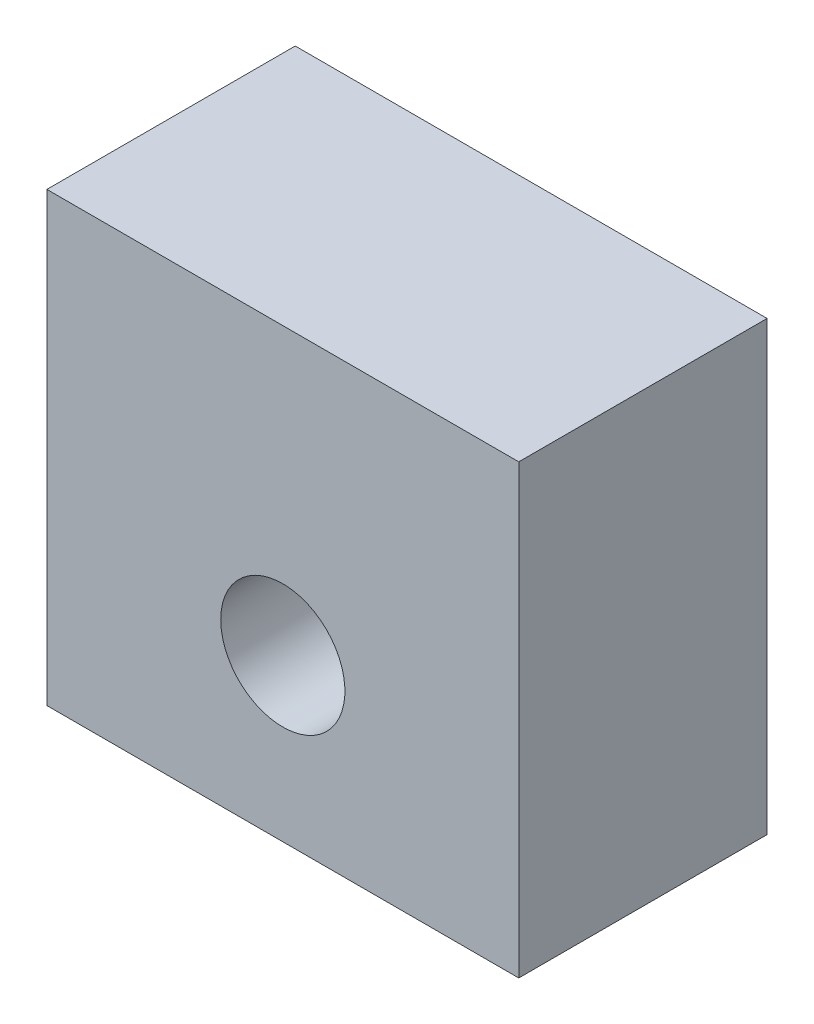
ISO-10303-21;
HEADER;
FILE_DESCRIPTION(('STEP AP214'),'2;1');
FILE_NAME('part.step','',(''),(''),'','','');
FILE_SCHEMA(('AUTOMOTIVE_DESIGN { 1 0 10303 214 1 1 1 1 }'));
ENDSEC;
DATA;
#1=APPLICATION_CONTEXT('core data for automotive mechanical design processes');
#2=APPLICATION_PROTOCOL_DEFINITION('international standard','automotive_design',2000,#1);
#3=PRODUCT_CONTEXT('',#1,'mechanical');
#4=PRODUCT('Part','Part','',(#3));
#5=PRODUCT_RELATED_PRODUCT_CATEGORY('part','',(#4));
#6=PRODUCT_DEFINITION_FORMATION('','',#4);
#7=PRODUCT_DEFINITION_CONTEXT('part definition',#1,'design');
#8=PRODUCT_DEFINITION('design','',#6,#7);
#9=PRODUCT_DEFINITION_SHAPE('','',#8);
#10=(LENGTH_UNIT() NAMED_UNIT(*) SI_UNIT(.MILLI.,.METRE.));
#11=(NAMED_UNIT(*) PLANE_ANGLE_UNIT() SI_UNIT($,.RADIAN.));
#12=(NAMED_UNIT(*) SI_UNIT($,.STERADIAN.) SOLID_ANGLE_UNIT());
#13=UNCERTAINTY_MEASURE_WITH_UNIT(LENGTH_MEASURE(1.E-05),#10,'distance_accuracy_value','');
#14=(GEOMETRIC_REPRESENTATION_CONTEXT(3) GLOBAL_UNCERTAINTY_ASSIGNED_CONTEXT((#13)) GLOBAL_UNIT_ASSIGNED_CONTEXT((#10,
#11,#12)) REPRESENTATION_CONTEXT('',''));
#15=CARTESIAN_POINT('',(0.,0.,0.));
#16=DIRECTION('',(0.,0.,1.));
#17=DIRECTION('',(1.,0.,0.));
#18=AXIS2_PLACEMENT_3D('',#15,#16,#17);
#19=CARTESIAN_POINT('',(0.,0.,10.));
#20=DIRECTION('',(1.,0.,0.));
#21=DIRECTION('',(0.,0.,-1.));
#22=AXIS2_PLACEMENT_3D('',#19,#20,#21);
#23=PLANE('',#22);
#24=DIRECTION('',(0.,-1.,0.));
#25=VECTOR('',#24,1.);
#26=CARTESIAN_POINT('',(0.,0.,0.));
#27=LINE('',#26,#25);
#28=CARTESIAN_POINT('',(0.,18.,0.));
#29=VERTEX_POINT('',#28);
#30=CARTESIAN_POINT('',(0.,0.,0.));
#31=VERTEX_POINT('',#30);
#32=EDGE_CURVE('E97',#29,#31,#27,.T.);
#33=ORIENTED_EDGE('',*,*,#32,.T.);
#34=DIRECTION('',(0.,0.,-1.));
#35=VECTOR('',#34,1.);
#36=CARTESIAN_POINT('',(0.,0.,10.));
#37=LINE('',#36,#35);
#38=CARTESIAN_POINT('',(0.,0.,10.));
#39=VERTEX_POINT('',#38);
#40=EDGE_CURVE('E11',#39,#31,#37,.T.);
#41=ORIENTED_EDGE('',*,*,#40,.F.);
#42=DIRECTION('',(0.,-1.,0.));
#43=VECTOR('',#42,1.);
#44=CARTESIAN_POINT('',(0.,0.,10.));
#45=LINE('',#44,#43);
#46=CARTESIAN_POINT('',(0.,18.,10.));
#47=VERTEX_POINT('',#46);
#48=EDGE_CURVE('E85',#47,#39,#45,.T.);
#49=ORIENTED_EDGE('',*,*,#48,.F.);
#50=DIRECTION('',(0.,0.,-1.));
#51=VECTOR('',#50,1.);
#52=CARTESIAN_POINT('',(0.,18.,10.));
#53=LINE('',#52,#51);
#54=EDGE_CURVE('E93',#47,#29,#53,.T.);
#55=ORIENTED_EDGE('',*,*,#54,.T.);
#56=EDGE_LOOP('',(#33,#41,#49,#55));
#57=FACE_BOUND('',#56,.T.);
#58=ADVANCED_FACE('F34',(#57),#23,.F.);
#59=CARTESIAN_POINT('',(0.,0.,10.));
#60=DIRECTION('',(0.,1.,0.));
#61=DIRECTION('',(0.,0.,1.));
#62=AXIS2_PLACEMENT_3D('',#59,#60,#61);
#63=PLANE('',#62);
#64=DIRECTION('',(1.,0.,0.));
#65=VECTOR('',#64,1.);
#66=CARTESIAN_POINT('',(0.,0.,0.));
#67=LINE('',#66,#65);
#68=CARTESIAN_POINT('',(19.,0.,0.));
#69=VERTEX_POINT('',#68);
#70=EDGE_CURVE('E89',#31,#69,#67,.T.);
#71=ORIENTED_EDGE('',*,*,#70,.T.);
#72=DIRECTION('',(0.,0.,-1.));
#73=VECTOR('',#72,1.);
#74=CARTESIAN_POINT('',(19.,0.,10.));
#75=LINE('',#74,#73);
#76=CARTESIAN_POINT('',(19.,0.,10.));
#77=VERTEX_POINT('',#76);
#78=EDGE_CURVE('E42',#77,#69,#75,.T.);
#79=ORIENTED_EDGE('',*,*,#78,.F.);
#80=DIRECTION('',(1.,0.,0.));
#81=VECTOR('',#80,1.);
#82=CARTESIAN_POINT('',(0.,0.,10.));
#83=LINE('',#82,#81);
#84=EDGE_CURVE('E80',#39,#77,#83,.T.);
#85=ORIENTED_EDGE('',*,*,#84,.F.);
#86=ORIENTED_EDGE('',*,*,#40,.T.);
#87=EDGE_LOOP('',(#71,#79,#85,#86));
#88=FACE_BOUND('',#87,.T.);
#89=ADVANCED_FACE('F88',(#88),#63,.F.);
#90=CARTESIAN_POINT('',(19.,0.,10.));
#91=DIRECTION('',(-1.,0.,0.));
#92=DIRECTION('',(0.,0.,1.));
#93=AXIS2_PLACEMENT_3D('',#90,#91,#92);
#94=PLANE('',#93);
#95=DIRECTION('',(0.,1.,0.));
#96=VECTOR('',#95,1.);
#97=CARTESIAN_POINT('',(19.,0.,0.));
#98=LINE('',#97,#96);
#99=CARTESIAN_POINT('',(19.,18.,0.));
#100=VERTEX_POINT('',#99);
#101=EDGE_CURVE('E67',#69,#100,#98,.T.);
#102=ORIENTED_EDGE('',*,*,#101,.T.);
#103=DIRECTION('',(0.,0.,-1.));
#104=VECTOR('',#103,1.);
#105=CARTESIAN_POINT('',(19.,18.,10.));
#106=LINE('',#105,#104);
#107=CARTESIAN_POINT('',(19.,18.,10.));
#108=VERTEX_POINT('',#107);
#109=EDGE_CURVE('E90',#108,#100,#106,.T.);
#110=ORIENTED_EDGE('',*,*,#109,.F.);
#111=DIRECTION('',(0.,1.,0.));
#112=VECTOR('',#111,1.);
#113=CARTESIAN_POINT('',(19.,0.,10.));
#114=LINE('',#113,#112);
#115=EDGE_CURVE('E83',#77,#108,#114,.T.);
#116=ORIENTED_EDGE('',*,*,#115,.F.);
#117=ORIENTED_EDGE('',*,*,#78,.T.);
#118=EDGE_LOOP('',(#102,#110,#116,#117));
#119=FACE_BOUND('',#118,.T.);
#120=ADVANCED_FACE('F91',(#119),#94,.F.);
#121=CARTESIAN_POINT('',(0.,18.,10.));
#122=DIRECTION('',(0.,-1.,0.));
#123=DIRECTION('',(0.,0.,-1.));
#124=AXIS2_PLACEMENT_3D('',#121,#122,#123);
#125=PLANE('',#124);
#126=DIRECTION('',(-1.,0.,0.));
#127=VECTOR('',#126,1.);
#128=CARTESIAN_POINT('',(0.,18.,0.));
#129=LINE('',#128,#127);
#130=EDGE_CURVE('E73',#100,#29,#129,.T.);
#131=ORIENTED_EDGE('',*,*,#130,.T.);
#132=ORIENTED_EDGE('',*,*,#54,.F.);
#133=DIRECTION('',(-1.,0.,0.));
#134=VECTOR('',#133,1.);
#135=CARTESIAN_POINT('',(0.,18.,10.));
#136=LINE('',#135,#134);
#137=EDGE_CURVE('E50',#108,#47,#136,.T.);
#138=ORIENTED_EDGE('',*,*,#137,.F.);
#139=ORIENTED_EDGE('',*,*,#109,.T.);
#140=EDGE_LOOP('',(#131,#132,#138,#139));
#141=FACE_BOUND('',#140,.T.);
#142=ADVANCED_FACE('F105',(#141),#125,.F.);
#143=CARTESIAN_POINT('',(0.,0.,10.));
#144=DIRECTION('',(0.,0.,-1.));
#145=DIRECTION('',(-1.,0.,0.));
#146=AXIS2_PLACEMENT_3D('',#143,#144,#145);
#147=PLANE('',#146);
#148=CARTESIAN_POINT('',(9.5,6.5,10.));
#149=DIRECTION('',(0.,0.,-1.));
#150=DIRECTION('',(-1.,0.,0.));
#151=AXIS2_PLACEMENT_3D('',#148,#149,#150);
#152=CIRCLE('',#151,2.5);
#153=CARTESIAN_POINT('',(7.,6.5,10.));
#154=VERTEX_POINT('',#153);
#155=EDGE_CURVE('E100',#154,#154,#152,.T.);
#156=ORIENTED_EDGE('',*,*,#155,.T.);
#157=EDGE_LOOP('',(#156));
#158=FACE_BOUND('',#157,.T.);
#159=ORIENTED_EDGE('',*,*,#48,.T.);
#160=ORIENTED_EDGE('',*,*,#84,.T.);
#161=ORIENTED_EDGE('',*,*,#115,.T.);
#162=ORIENTED_EDGE('',*,*,#137,.T.);
#163=EDGE_LOOP('',(#159,#160,#161,#162));
#164=FACE_BOUND('',#163,.T.);
#165=ADVANCED_FACE('F81',(#158,#164),#147,.F.);
#166=CARTESIAN_POINT('',(0.,0.,0.));
#167=DIRECTION('',(0.,0.,-1.));
#168=DIRECTION('',(-1.,0.,0.));
#169=AXIS2_PLACEMENT_3D('',#166,#167,#168);
#170=PLANE('',#169);
#171=CARTESIAN_POINT('',(9.5,6.5,0.));
#172=DIRECTION('',(0.,0.,-1.));
#173=DIRECTION('',(-1.,0.,0.));
#174=AXIS2_PLACEMENT_3D('',#171,#172,#173);
#175=CIRCLE('',#174,2.5);
#176=CARTESIAN_POINT('',(7.,6.5,0.));
#177=VERTEX_POINT('',#176);
#178=EDGE_CURVE('E111',#177,#177,#175,.T.);
#179=ORIENTED_EDGE('',*,*,#178,.F.);
#180=EDGE_LOOP('',(#179));
#181=FACE_BOUND('',#180,.T.);
#182=ORIENTED_EDGE('',*,*,#32,.F.);
#183=ORIENTED_EDGE('',*,*,#130,.F.);
#184=ORIENTED_EDGE('',*,*,#101,.F.);
#185=ORIENTED_EDGE('',*,*,#70,.F.);
#186=EDGE_LOOP('',(#182,#183,#184,#185));
#187=FACE_BOUND('',#186,.T.);
#188=ADVANCED_FACE('F108',(#181,#187),#170,.T.);
#189=CARTESIAN_POINT('',(9.5,6.5,10.));
#190=DIRECTION('',(0.,0.,-1.));
#191=DIRECTION('',(-1.,0.,0.));
#192=AXIS2_PLACEMENT_3D('',#189,#190,#191);
#193=CYLINDRICAL_SURFACE('',#192,2.5);
#194=ORIENTED_EDGE('',*,*,#155,.F.);
#195=EDGE_LOOP('',(#194));
#196=FACE_BOUND('',#195,.T.);
#197=ORIENTED_EDGE('',*,*,#178,.T.);
#198=EDGE_LOOP('',(#197));
#199=FACE_BOUND('',#198,.T.);
#200=ADVANCED_FACE('F118',(#196,#199),#193,.F.);
#201=CLOSED_SHELL('',(#58,#89,#120,#142,#165,#188,#200));
#202=MANIFOLD_SOLID_BREP('B2',#201);
#203=ADVANCED_BREP_SHAPE_REPRESENTATION('',(#18,#202),#14);
#204=SHAPE_DEFINITION_REPRESENTATION(#9,#203);
ENDSEC;
END-ISO-10303-21;
